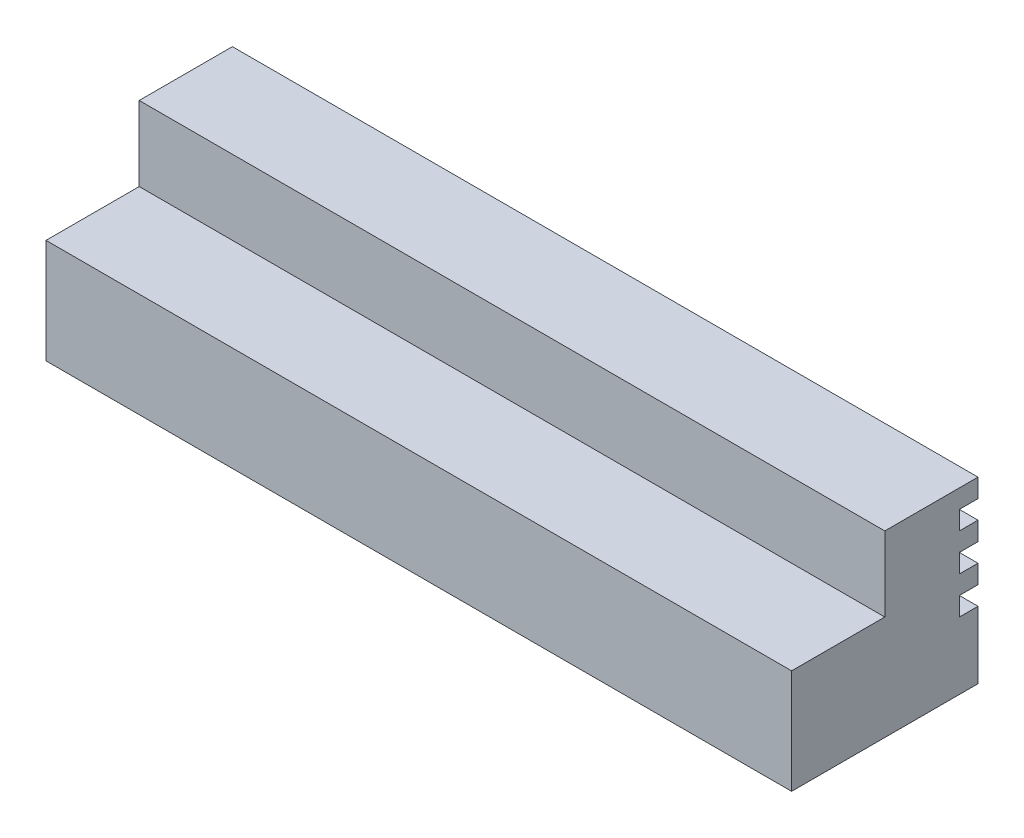
ISO-10303-21;
HEADER;
FILE_DESCRIPTION(('STEP AP214'),'2;1');
FILE_NAME('part.step','',(''),(''),'','','');
FILE_SCHEMA(('AUTOMOTIVE_DESIGN { 1 0 10303 214 1 1 1 1 }'));
ENDSEC;
DATA;
#1=APPLICATION_CONTEXT('core data for automotive mechanical design processes');
#2=APPLICATION_PROTOCOL_DEFINITION('international standard','automotive_design',2000,#1);
#3=PRODUCT_CONTEXT('',#1,'mechanical');
#4=PRODUCT('Part','Part','',(#3));
#5=PRODUCT_RELATED_PRODUCT_CATEGORY('part','',(#4));
#6=PRODUCT_DEFINITION_FORMATION('','',#4);
#7=PRODUCT_DEFINITION_CONTEXT('part definition',#1,'design');
#8=PRODUCT_DEFINITION('design','',#6,#7);
#9=PRODUCT_DEFINITION_SHAPE('','',#8);
#10=(LENGTH_UNIT() NAMED_UNIT(*) SI_UNIT(.MILLI.,.METRE.));
#11=(NAMED_UNIT(*) PLANE_ANGLE_UNIT() SI_UNIT($,.RADIAN.));
#12=(NAMED_UNIT(*) SI_UNIT($,.STERADIAN.) SOLID_ANGLE_UNIT());
#13=UNCERTAINTY_MEASURE_WITH_UNIT(LENGTH_MEASURE(1.E-05),#10,'distance_accuracy_value','');
#14=(GEOMETRIC_REPRESENTATION_CONTEXT(3) GLOBAL_UNCERTAINTY_ASSIGNED_CONTEXT((#13)) GLOBAL_UNIT_ASSIGNED_CONTEXT((#10,
#11,#12)) REPRESENTATION_CONTEXT('',''));
#15=CARTESIAN_POINT('',(0.,0.,0.));
#16=DIRECTION('',(0.,0.,1.));
#17=DIRECTION('',(1.,0.,0.));
#18=AXIS2_PLACEMENT_3D('',#15,#16,#17);
#19=CARTESIAN_POINT('',(0.,48.,-50.));
#20=DIRECTION('',(0.,0.,1.));
#21=DIRECTION('',(1.,0.,0.));
#22=AXIS2_PLACEMENT_3D('',#19,#20,#21);
#23=PLANE('',#22);
#24=DIRECTION('',(0.,-1.,0.));
#25=VECTOR('',#24,1.);
#26=CARTESIAN_POINT('',(0.,48.,-50.));
#27=LINE('',#26,#25);
#28=CARTESIAN_POINT('',(0.,18.,-50.));
#29=VERTEX_POINT('',#28);
#30=CARTESIAN_POINT('',(0.,0.,-50.));
#31=VERTEX_POINT('',#30);
#32=EDGE_CURVE('E183',#29,#31,#27,.T.);
#33=ORIENTED_EDGE('',*,*,#32,.F.);
#34=DIRECTION('',(1.,0.,0.));
#35=VECTOR('',#34,1.);
#36=CARTESIAN_POINT('',(0.,18.,-50.));
#37=LINE('',#36,#35);
#38=CARTESIAN_POINT('',(200.,18.,-50.));
#39=VERTEX_POINT('',#38);
#40=EDGE_CURVE('E288',#29,#39,#37,.T.);
#41=ORIENTED_EDGE('',*,*,#40,.T.);
#42=DIRECTION('',(0.,-1.,0.));
#43=VECTOR('',#42,1.);
#44=CARTESIAN_POINT('',(200.,48.,-50.));
#45=LINE('',#44,#43);
#46=CARTESIAN_POINT('',(200.,0.,-50.));
#47=VERTEX_POINT('',#46);
#48=EDGE_CURVE('E191',#39,#47,#45,.T.);
#49=ORIENTED_EDGE('',*,*,#48,.T.);
#50=DIRECTION('',(-1.,0.,0.));
#51=VECTOR('',#50,1.);
#52=CARTESIAN_POINT('',(0.,0.,-50.));
#53=LINE('',#52,#51);
#54=EDGE_CURVE('E192',#47,#31,#53,.T.);
#55=ORIENTED_EDGE('',*,*,#54,.T.);
#56=EDGE_LOOP('',(#33,#41,#49,#55));
#57=FACE_BOUND('',#56,.T.);
#58=ADVANCED_FACE('F34',(#57),#23,.F.);
#59=CARTESIAN_POINT('',(200.,28.,-50.));
#60=VERTEX_POINT('',#59);
#61=CARTESIAN_POINT('',(200.,23.,-50.));
#62=VERTEX_POINT('',#61);
#63=EDGE_CURVE('E175',#60,#62,#45,.T.);
#64=ORIENTED_EDGE('',*,*,#63,.T.);
#65=DIRECTION('',(1.,0.,0.));
#66=VECTOR('',#65,1.);
#67=CARTESIAN_POINT('',(0.,23.,-50.));
#68=LINE('',#67,#66);
#69=CARTESIAN_POINT('',(0.,23.,-50.));
#70=VERTEX_POINT('',#69);
#71=EDGE_CURVE('E49',#70,#62,#68,.T.);
#72=ORIENTED_EDGE('',*,*,#71,.F.);
#73=CARTESIAN_POINT('',(0.,28.,-50.));
#74=VERTEX_POINT('',#73);
#75=EDGE_CURVE('E173',#74,#70,#27,.T.);
#76=ORIENTED_EDGE('',*,*,#75,.F.);
#77=DIRECTION('',(1.,0.,0.));
#78=VECTOR('',#77,1.);
#79=CARTESIAN_POINT('',(0.,28.,-50.));
#80=LINE('',#79,#78);
#81=EDGE_CURVE('E266',#74,#60,#80,.T.);
#82=ORIENTED_EDGE('',*,*,#81,.T.);
#83=EDGE_LOOP('',(#64,#72,#76,#82));
#84=FACE_BOUND('',#83,.T.);
#85=ADVANCED_FACE('F171',(#84),#23,.F.);
#86=CARTESIAN_POINT('',(200.,38.,-50.));
#87=VERTEX_POINT('',#86);
#88=CARTESIAN_POINT('',(200.,33.,-50.));
#89=VERTEX_POINT('',#88);
#90=EDGE_CURVE('E196',#87,#89,#45,.T.);
#91=ORIENTED_EDGE('',*,*,#90,.T.);
#92=DIRECTION('',(1.,0.,0.));
#93=VECTOR('',#92,1.);
#94=CARTESIAN_POINT('',(0.,33.,-50.));
#95=LINE('',#94,#93);
#96=CARTESIAN_POINT('',(0.,33.,-50.));
#97=VERTEX_POINT('',#96);
#98=EDGE_CURVE('E57',#97,#89,#95,.T.);
#99=ORIENTED_EDGE('',*,*,#98,.F.);
#100=CARTESIAN_POINT('',(0.,38.,-50.));
#101=VERTEX_POINT('',#100);
#102=EDGE_CURVE('E182',#101,#97,#27,.T.);
#103=ORIENTED_EDGE('',*,*,#102,.F.);
#104=DIRECTION('',(1.,0.,0.));
#105=VECTOR('',#104,1.);
#106=CARTESIAN_POINT('',(0.,38.,-50.));
#107=LINE('',#106,#105);
#108=EDGE_CURVE('E243',#101,#87,#107,.T.);
#109=ORIENTED_EDGE('',*,*,#108,.T.);
#110=EDGE_LOOP('',(#91,#99,#103,#109));
#111=FACE_BOUND('',#110,.T.);
#112=ADVANCED_FACE('F319',(#111),#23,.F.);
#113=CARTESIAN_POINT('',(0.,48.,0.));
#114=DIRECTION('',(1.,0.,0.));
#115=DIRECTION('',(0.,0.,-1.));
#116=AXIS2_PLACEMENT_3D('',#113,#114,#115);
#117=PLANE('',#116);
#118=DIRECTION('',(0.,-1.,0.));
#119=VECTOR('',#118,1.);
#120=CARTESIAN_POINT('',(0.,23.,-45.));
#121=LINE('',#120,#119);
#122=CARTESIAN_POINT('',(0.,23.,-45.));
#123=VERTEX_POINT('',#122);
#124=CARTESIAN_POINT('',(0.,18.,-45.));
#125=VERTEX_POINT('',#124);
#126=EDGE_CURVE('E165',#123,#125,#121,.T.);
#127=ORIENTED_EDGE('',*,*,#126,.T.);
#128=DIRECTION('',(0.,0.,-1.));
#129=VECTOR('',#128,1.);
#130=CARTESIAN_POINT('',(0.,18.,-50.));
#131=LINE('',#130,#129);
#132=EDGE_CURVE('E176',#125,#29,#131,.T.);
#133=ORIENTED_EDGE('',*,*,#132,.T.);
#134=ORIENTED_EDGE('',*,*,#32,.T.);
#135=DIRECTION('',(0.,0.,1.));
#136=VECTOR('',#135,1.);
#137=CARTESIAN_POINT('',(0.,0.,0.));
#138=LINE('',#137,#136);
#139=CARTESIAN_POINT('',(0.,0.,0.));
#140=VERTEX_POINT('',#139);
#141=EDGE_CURVE('E219',#31,#140,#138,.T.);
#142=ORIENTED_EDGE('',*,*,#141,.T.);
#143=DIRECTION('',(0.,-1.,0.));
#144=VECTOR('',#143,1.);
#145=CARTESIAN_POINT('',(0.,48.,0.));
#146=LINE('',#145,#144);
#147=CARTESIAN_POINT('',(0.,28.,0.));
#148=VERTEX_POINT('',#147);
#149=EDGE_CURVE('E11',#148,#140,#146,.T.);
#150=ORIENTED_EDGE('',*,*,#149,.F.);
#151=DIRECTION('',(0.,0.,-1.));
#152=VECTOR('',#151,1.);
#153=CARTESIAN_POINT('',(0.,28.,0.));
#154=LINE('',#153,#152);
#155=CARTESIAN_POINT('',(0.,28.,-25.));
#156=VERTEX_POINT('',#155);
#157=EDGE_CURVE('E241',#148,#156,#154,.T.);
#158=ORIENTED_EDGE('',*,*,#157,.T.);
#159=DIRECTION('',(0.,1.,0.));
#160=VECTOR('',#159,1.);
#161=CARTESIAN_POINT('',(0.,48.,-25.));
#162=LINE('',#161,#160);
#163=CARTESIAN_POINT('',(0.,48.,-25.));
#164=VERTEX_POINT('',#163);
#165=EDGE_CURVE('E235',#156,#164,#162,.T.);
#166=ORIENTED_EDGE('',*,*,#165,.T.);
#167=DIRECTION('',(0.,0.,1.));
#168=VECTOR('',#167,1.);
#169=CARTESIAN_POINT('',(0.,48.,0.));
#170=LINE('',#169,#168);
#171=CARTESIAN_POINT('',(0.,48.,-50.));
#172=VERTEX_POINT('',#171);
#173=EDGE_CURVE('E223',#172,#164,#170,.T.);
#174=ORIENTED_EDGE('',*,*,#173,.F.);
#175=CARTESIAN_POINT('',(0.,43.,-50.));
#176=VERTEX_POINT('',#175);
#177=EDGE_CURVE('E186',#172,#176,#27,.T.);
#178=ORIENTED_EDGE('',*,*,#177,.T.);
#179=DIRECTION('',(0.,0.,1.));
#180=VECTOR('',#179,1.);
#181=CARTESIAN_POINT('',(0.,43.,-50.));
#182=LINE('',#181,#180);
#183=CARTESIAN_POINT('',(0.,43.,-45.));
#184=VERTEX_POINT('',#183);
#185=EDGE_CURVE('E259',#176,#184,#182,.T.);
#186=ORIENTED_EDGE('',*,*,#185,.T.);
#187=DIRECTION('',(0.,-1.,0.));
#188=VECTOR('',#187,1.);
#189=CARTESIAN_POINT('',(0.,43.,-45.));
#190=LINE('',#189,#188);
#191=CARTESIAN_POINT('',(0.,38.,-45.));
#192=VERTEX_POINT('',#191);
#193=EDGE_CURVE('E269',#184,#192,#190,.T.);
#194=ORIENTED_EDGE('',*,*,#193,.T.);
#195=DIRECTION('',(0.,0.,-1.));
#196=VECTOR('',#195,1.);
#197=CARTESIAN_POINT('',(0.,38.,-50.));
#198=LINE('',#197,#196);
#199=EDGE_CURVE('E251',#192,#101,#198,.T.);
#200=ORIENTED_EDGE('',*,*,#199,.T.);
#201=ORIENTED_EDGE('',*,*,#102,.T.);
#202=DIRECTION('',(0.,0.,1.));
#203=VECTOR('',#202,1.);
#204=CARTESIAN_POINT('',(0.,33.,-50.));
#205=LINE('',#204,#203);
#206=CARTESIAN_POINT('',(0.,33.,-45.));
#207=VERTEX_POINT('',#206);
#208=EDGE_CURVE('E282',#97,#207,#205,.T.);
#209=ORIENTED_EDGE('',*,*,#208,.T.);
#210=DIRECTION('',(0.,-1.,0.));
#211=VECTOR('',#210,1.);
#212=CARTESIAN_POINT('',(0.,33.,-45.));
#213=LINE('',#212,#211);
#214=CARTESIAN_POINT('',(0.,28.,-45.));
#215=VERTEX_POINT('',#214);
#216=EDGE_CURVE('E290',#207,#215,#213,.T.);
#217=ORIENTED_EDGE('',*,*,#216,.T.);
#218=DIRECTION('',(0.,0.,-1.));
#219=VECTOR('',#218,1.);
#220=CARTESIAN_POINT('',(0.,28.,-50.));
#221=LINE('',#220,#219);
#222=EDGE_CURVE('E181',#215,#74,#221,.T.);
#223=ORIENTED_EDGE('',*,*,#222,.T.);
#224=ORIENTED_EDGE('',*,*,#75,.T.);
#225=DIRECTION('',(0.,0.,1.));
#226=VECTOR('',#225,1.);
#227=CARTESIAN_POINT('',(0.,23.,-50.));
#228=LINE('',#227,#226);
#229=EDGE_CURVE('E158',#70,#123,#228,.T.);
#230=ORIENTED_EDGE('',*,*,#229,.T.);
#231=EDGE_LOOP('',(#127,#133,#134,#142,#150,#158,#166,#174,#178,#186,#194,#200,#201,#209,#217,
#223,#224,#230));
#232=FACE_BOUND('',#231,.T.);
#233=ADVANCED_FACE('F36',(#232),#117,.F.);
#234=CARTESIAN_POINT('',(0.,48.,0.));
#235=DIRECTION('',(0.,0.,-1.));
#236=DIRECTION('',(-1.,0.,0.));
#237=AXIS2_PLACEMENT_3D('',#234,#235,#236);
#238=PLANE('',#237);
#239=DIRECTION('',(0.,-1.,0.));
#240=VECTOR('',#239,1.);
#241=CARTESIAN_POINT('',(200.,48.,0.));
#242=LINE('',#241,#240);
#243=CARTESIAN_POINT('',(200.,28.,0.));
#244=VERTEX_POINT('',#243);
#245=CARTESIAN_POINT('',(200.,0.,0.));
#246=VERTEX_POINT('',#245);
#247=EDGE_CURVE('E42',#244,#246,#242,.T.);
#248=ORIENTED_EDGE('',*,*,#247,.F.);
#249=DIRECTION('',(1.,0.,0.));
#250=VECTOR('',#249,1.);
#251=CARTESIAN_POINT('',(0.,28.,0.));
#252=LINE('',#251,#250);
#253=EDGE_CURVE('E232',#148,#244,#252,.T.);
#254=ORIENTED_EDGE('',*,*,#253,.F.);
#255=ORIENTED_EDGE('',*,*,#149,.T.);
#256=DIRECTION('',(1.,0.,0.));
#257=VECTOR('',#256,1.);
#258=CARTESIAN_POINT('',(0.,0.,0.));
#259=LINE('',#258,#257);
#260=EDGE_CURVE('E213',#140,#246,#259,.T.);
#261=ORIENTED_EDGE('',*,*,#260,.T.);
#262=EDGE_LOOP('',(#248,#254,#255,#261));
#263=FACE_BOUND('',#262,.T.);
#264=ADVANCED_FACE('F214',(#263),#238,.F.);
#265=CARTESIAN_POINT('',(200.,48.,0.));
#266=DIRECTION('',(-1.,0.,0.));
#267=DIRECTION('',(0.,0.,1.));
#268=AXIS2_PLACEMENT_3D('',#265,#266,#267);
#269=PLANE('',#268);
#270=ORIENTED_EDGE('',*,*,#48,.F.);
#271=DIRECTION('',(0.,0.,-1.));
#272=VECTOR('',#271,1.);
#273=CARTESIAN_POINT('',(200.,18.,-50.));
#274=LINE('',#273,#272);
#275=CARTESIAN_POINT('',(200.,18.,-45.));
#276=VERTEX_POINT('',#275);
#277=EDGE_CURVE('E166',#276,#39,#274,.T.);
#278=ORIENTED_EDGE('',*,*,#277,.F.);
#279=DIRECTION('',(0.,-1.,0.));
#280=VECTOR('',#279,1.);
#281=CARTESIAN_POINT('',(200.,23.,-45.));
#282=LINE('',#281,#280);
#283=CARTESIAN_POINT('',(200.,23.,-45.));
#284=VERTEX_POINT('',#283);
#285=EDGE_CURVE('E300',#284,#276,#282,.T.);
#286=ORIENTED_EDGE('',*,*,#285,.F.);
#287=DIRECTION('',(0.,0.,1.));
#288=VECTOR('',#287,1.);
#289=CARTESIAN_POINT('',(200.,23.,-50.));
#290=LINE('',#289,#288);
#291=EDGE_CURVE('E303',#62,#284,#290,.T.);
#292=ORIENTED_EDGE('',*,*,#291,.F.);
#293=ORIENTED_EDGE('',*,*,#63,.F.);
#294=DIRECTION('',(0.,0.,-1.));
#295=VECTOR('',#294,1.);
#296=CARTESIAN_POINT('',(200.,28.,-50.));
#297=LINE('',#296,#295);
#298=CARTESIAN_POINT('',(200.,28.,-45.));
#299=VERTEX_POINT('',#298);
#300=EDGE_CURVE('E280',#299,#60,#297,.T.);
#301=ORIENTED_EDGE('',*,*,#300,.F.);
#302=DIRECTION('',(0.,-1.,0.));
#303=VECTOR('',#302,1.);
#304=CARTESIAN_POINT('',(200.,33.,-45.));
#305=LINE('',#304,#303);
#306=CARTESIAN_POINT('',(200.,33.,-45.));
#307=VERTEX_POINT('',#306);
#308=EDGE_CURVE('E283',#307,#299,#305,.T.);
#309=ORIENTED_EDGE('',*,*,#308,.F.);
#310=DIRECTION('',(0.,0.,1.));
#311=VECTOR('',#310,1.);
#312=CARTESIAN_POINT('',(200.,33.,-50.));
#313=LINE('',#312,#311);
#314=EDGE_CURVE('E286',#89,#307,#313,.T.);
#315=ORIENTED_EDGE('',*,*,#314,.F.);
#316=ORIENTED_EDGE('',*,*,#90,.F.);
#317=DIRECTION('',(0.,0.,-1.));
#318=VECTOR('',#317,1.);
#319=CARTESIAN_POINT('',(200.,38.,-50.));
#320=LINE('',#319,#318);
#321=CARTESIAN_POINT('',(200.,38.,-45.));
#322=VERTEX_POINT('',#321);
#323=EDGE_CURVE('E257',#322,#87,#320,.T.);
#324=ORIENTED_EDGE('',*,*,#323,.F.);
#325=DIRECTION('',(0.,-1.,0.));
#326=VECTOR('',#325,1.);
#327=CARTESIAN_POINT('',(200.,43.,-45.));
#328=LINE('',#327,#326);
#329=CARTESIAN_POINT('',(200.,43.,-45.));
#330=VERTEX_POINT('',#329);
#331=EDGE_CURVE('E260',#330,#322,#328,.T.);
#332=ORIENTED_EDGE('',*,*,#331,.F.);
#333=DIRECTION('',(0.,0.,1.));
#334=VECTOR('',#333,1.);
#335=CARTESIAN_POINT('',(200.,43.,-50.));
#336=LINE('',#335,#334);
#337=CARTESIAN_POINT('',(200.,43.,-50.));
#338=VERTEX_POINT('',#337);
#339=EDGE_CURVE('E263',#338,#330,#336,.T.);
#340=ORIENTED_EDGE('',*,*,#339,.F.);
#341=CARTESIAN_POINT('',(200.,48.,-50.));
#342=VERTEX_POINT('',#341);
#343=EDGE_CURVE('E194',#342,#338,#45,.T.);
#344=ORIENTED_EDGE('',*,*,#343,.F.);
#345=DIRECTION('',(0.,0.,-1.));
#346=VECTOR('',#345,1.);
#347=CARTESIAN_POINT('',(200.,48.,0.));
#348=LINE('',#347,#346);
#349=CARTESIAN_POINT('',(200.,48.,-25.));
#350=VERTEX_POINT('',#349);
#351=EDGE_CURVE('E228',#350,#342,#348,.T.);
#352=ORIENTED_EDGE('',*,*,#351,.F.);
#353=DIRECTION('',(0.,1.,0.));
#354=VECTOR('',#353,1.);
#355=CARTESIAN_POINT('',(200.,48.,-25.));
#356=LINE('',#355,#354);
#357=CARTESIAN_POINT('',(200.,28.,-25.));
#358=VERTEX_POINT('',#357);
#359=EDGE_CURVE('E239',#358,#350,#356,.T.);
#360=ORIENTED_EDGE('',*,*,#359,.F.);
#361=DIRECTION('',(0.,0.,-1.));
#362=VECTOR('',#361,1.);
#363=CARTESIAN_POINT('',(200.,28.,0.));
#364=LINE('',#363,#362);
#365=EDGE_CURVE('E209',#244,#358,#364,.T.);
#366=ORIENTED_EDGE('',*,*,#365,.F.);
#367=ORIENTED_EDGE('',*,*,#247,.T.);
#368=DIRECTION('',(0.,0.,-1.));
#369=VECTOR('',#368,1.);
#370=CARTESIAN_POINT('',(200.,0.,0.));
#371=LINE('',#370,#369);
#372=EDGE_CURVE('E205',#246,#47,#371,.T.);
#373=ORIENTED_EDGE('',*,*,#372,.T.);
#374=EDGE_LOOP('',(#270,#278,#286,#292,#293,#301,#309,#315,#316,#324,#332,#340,#344,#352,#360,
#366,#367,#373));
#375=FACE_BOUND('',#374,.T.);
#376=ADVANCED_FACE('F203',(#375),#269,.F.);
#377=ORIENTED_EDGE('',*,*,#343,.T.);
#378=DIRECTION('',(1.,0.,0.));
#379=VECTOR('',#378,1.);
#380=CARTESIAN_POINT('',(0.,43.,-50.));
#381=LINE('',#380,#379);
#382=EDGE_CURVE('E248',#176,#338,#381,.T.);
#383=ORIENTED_EDGE('',*,*,#382,.F.);
#384=ORIENTED_EDGE('',*,*,#177,.F.);
#385=DIRECTION('',(-1.,0.,0.));
#386=VECTOR('',#385,1.);
#387=CARTESIAN_POINT('',(0.,48.,-50.));
#388=LINE('',#387,#386);
#389=EDGE_CURVE('E187',#342,#172,#388,.T.);
#390=ORIENTED_EDGE('',*,*,#389,.F.);
#391=EDGE_LOOP('',(#377,#383,#384,#390));
#392=FACE_BOUND('',#391,.T.);
#393=ADVANCED_FACE('F342',(#392),#23,.F.);
#394=CARTESIAN_POINT('',(0.,48.,-50.));
#395=DIRECTION('',(0.,-1.,0.));
#396=DIRECTION('',(0.,0.,-1.));
#397=AXIS2_PLACEMENT_3D('',#394,#395,#396);
#398=PLANE('',#397);
#399=ORIENTED_EDGE('',*,*,#173,.T.);
#400=DIRECTION('',(1.,0.,0.));
#401=VECTOR('',#400,1.);
#402=CARTESIAN_POINT('',(0.,48.,-25.));
#403=LINE('',#402,#401);
#404=EDGE_CURVE('E226',#164,#350,#403,.T.);
#405=ORIENTED_EDGE('',*,*,#404,.T.);
#406=ORIENTED_EDGE('',*,*,#351,.T.);
#407=ORIENTED_EDGE('',*,*,#389,.T.);
#408=EDGE_LOOP('',(#399,#405,#406,#407));
#409=FACE_BOUND('',#408,.T.);
#410=ADVANCED_FACE('F346',(#409),#398,.F.);
#411=CARTESIAN_POINT('',(0.,0.,-50.));
#412=DIRECTION('',(0.,-1.,0.));
#413=DIRECTION('',(0.,0.,-1.));
#414=AXIS2_PLACEMENT_3D('',#411,#412,#413);
#415=PLANE('',#414);
#416=ORIENTED_EDGE('',*,*,#141,.F.);
#417=ORIENTED_EDGE('',*,*,#54,.F.);
#418=ORIENTED_EDGE('',*,*,#372,.F.);
#419=ORIENTED_EDGE('',*,*,#260,.F.);
#420=EDGE_LOOP('',(#416,#417,#418,#419));
#421=FACE_BOUND('',#420,.T.);
#422=ADVANCED_FACE('F221',(#421),#415,.T.);
#423=CARTESIAN_POINT('',(0.,48.,-25.));
#424=DIRECTION('',(0.,0.,-1.));
#425=DIRECTION('',(0.,1.,0.));
#426=AXIS2_PLACEMENT_3D('',#423,#424,#425);
#427=PLANE('',#426);
#428=ORIENTED_EDGE('',*,*,#359,.T.);
#429=ORIENTED_EDGE('',*,*,#404,.F.);
#430=ORIENTED_EDGE('',*,*,#165,.F.);
#431=DIRECTION('',(1.,0.,0.));
#432=VECTOR('',#431,1.);
#433=CARTESIAN_POINT('',(0.,28.,-25.));
#434=LINE('',#433,#432);
#435=EDGE_CURVE('E234',#156,#358,#434,.T.);
#436=ORIENTED_EDGE('',*,*,#435,.T.);
#437=EDGE_LOOP('',(#428,#429,#430,#436));
#438=FACE_BOUND('',#437,.T.);
#439=ADVANCED_FACE('F348',(#438),#427,.F.);
#440=CARTESIAN_POINT('',(0.,28.,0.));
#441=DIRECTION('',(0.,-1.,0.));
#442=DIRECTION('',(0.,0.,-1.));
#443=AXIS2_PLACEMENT_3D('',#440,#441,#442);
#444=PLANE('',#443);
#445=ORIENTED_EDGE('',*,*,#365,.T.);
#446=ORIENTED_EDGE('',*,*,#435,.F.);
#447=ORIENTED_EDGE('',*,*,#157,.F.);
#448=ORIENTED_EDGE('',*,*,#253,.T.);
#449=EDGE_LOOP('',(#445,#446,#447,#448));
#450=FACE_BOUND('',#449,.T.);
#451=ADVANCED_FACE('F351',(#450),#444,.F.);
#452=CARTESIAN_POINT('',(0.,38.,-50.));
#453=DIRECTION('',(0.,-1.,0.));
#454=DIRECTION('',(0.,0.,-1.));
#455=AXIS2_PLACEMENT_3D('',#452,#453,#454);
#456=PLANE('',#455);
#457=ORIENTED_EDGE('',*,*,#323,.T.);
#458=ORIENTED_EDGE('',*,*,#108,.F.);
#459=ORIENTED_EDGE('',*,*,#199,.F.);
#460=DIRECTION('',(1.,0.,0.));
#461=VECTOR('',#460,1.);
#462=CARTESIAN_POINT('',(0.,38.,-45.));
#463=LINE('',#462,#461);
#464=EDGE_CURVE('E253',#192,#322,#463,.T.);
#465=ORIENTED_EDGE('',*,*,#464,.T.);
#466=EDGE_LOOP('',(#457,#458,#459,#465));
#467=FACE_BOUND('',#466,.T.);
#468=ADVANCED_FACE('F332',(#467),#456,.F.);
#469=CARTESIAN_POINT('',(0.,43.,-45.));
#470=DIRECTION('',(0.,0.,1.));
#471=DIRECTION('',(1.,0.,0.));
#472=AXIS2_PLACEMENT_3D('',#469,#470,#471);
#473=PLANE('',#472);
#474=ORIENTED_EDGE('',*,*,#331,.T.);
#475=ORIENTED_EDGE('',*,*,#464,.F.);
#476=ORIENTED_EDGE('',*,*,#193,.F.);
#477=DIRECTION('',(1.,0.,0.));
#478=VECTOR('',#477,1.);
#479=CARTESIAN_POINT('',(0.,43.,-45.));
#480=LINE('',#479,#478);
#481=EDGE_CURVE('E250',#184,#330,#480,.T.);
#482=ORIENTED_EDGE('',*,*,#481,.T.);
#483=EDGE_LOOP('',(#474,#475,#476,#482));
#484=FACE_BOUND('',#483,.T.);
#485=ADVANCED_FACE('F334',(#484),#473,.F.);
#486=CARTESIAN_POINT('',(0.,43.,-50.));
#487=DIRECTION('',(0.,1.,0.));
#488=DIRECTION('',(0.,0.,1.));
#489=AXIS2_PLACEMENT_3D('',#486,#487,#488);
#490=PLANE('',#489);
#491=ORIENTED_EDGE('',*,*,#339,.T.);
#492=ORIENTED_EDGE('',*,*,#481,.F.);
#493=ORIENTED_EDGE('',*,*,#185,.F.);
#494=ORIENTED_EDGE('',*,*,#382,.T.);
#495=EDGE_LOOP('',(#491,#492,#493,#494));
#496=FACE_BOUND('',#495,.T.);
#497=ADVANCED_FACE('F352',(#496),#490,.F.);
#498=CARTESIAN_POINT('',(0.,28.,-50.));
#499=DIRECTION('',(0.,-1.,0.));
#500=DIRECTION('',(0.,0.,-1.));
#501=AXIS2_PLACEMENT_3D('',#498,#499,#500);
#502=PLANE('',#501);
#503=ORIENTED_EDGE('',*,*,#300,.T.);
#504=ORIENTED_EDGE('',*,*,#81,.F.);
#505=ORIENTED_EDGE('',*,*,#222,.F.);
#506=DIRECTION('',(1.,0.,0.));
#507=VECTOR('',#506,1.);
#508=CARTESIAN_POINT('',(0.,28.,-45.));
#509=LINE('',#508,#507);
#510=EDGE_CURVE('E277',#215,#299,#509,.T.);
#511=ORIENTED_EDGE('',*,*,#510,.T.);
#512=EDGE_LOOP('',(#503,#504,#505,#511));
#513=FACE_BOUND('',#512,.T.);
#514=ADVANCED_FACE('F354',(#513),#502,.F.);
#515=CARTESIAN_POINT('',(0.,33.,-45.));
#516=DIRECTION('',(0.,0.,1.));
#517=DIRECTION('',(1.,0.,0.));
#518=AXIS2_PLACEMENT_3D('',#515,#516,#517);
#519=PLANE('',#518);
#520=ORIENTED_EDGE('',*,*,#308,.T.);
#521=ORIENTED_EDGE('',*,*,#510,.F.);
#522=ORIENTED_EDGE('',*,*,#216,.F.);
#523=DIRECTION('',(1.,0.,0.));
#524=VECTOR('',#523,1.);
#525=CARTESIAN_POINT('',(0.,33.,-45.));
#526=LINE('',#525,#524);
#527=EDGE_CURVE('E275',#207,#307,#526,.T.);
#528=ORIENTED_EDGE('',*,*,#527,.T.);
#529=EDGE_LOOP('',(#520,#521,#522,#528));
#530=FACE_BOUND('',#529,.T.);
#531=ADVANCED_FACE('F328',(#530),#519,.F.);
#532=CARTESIAN_POINT('',(0.,33.,-50.));
#533=DIRECTION('',(0.,1.,0.));
#534=DIRECTION('',(0.,0.,1.));
#535=AXIS2_PLACEMENT_3D('',#532,#533,#534);
#536=PLANE('',#535);
#537=ORIENTED_EDGE('',*,*,#314,.T.);
#538=ORIENTED_EDGE('',*,*,#527,.F.);
#539=ORIENTED_EDGE('',*,*,#208,.F.);
#540=ORIENTED_EDGE('',*,*,#98,.T.);
#541=EDGE_LOOP('',(#537,#538,#539,#540));
#542=FACE_BOUND('',#541,.T.);
#543=ADVANCED_FACE('F325',(#542),#536,.F.);
#544=CARTESIAN_POINT('',(0.,18.,-50.));
#545=DIRECTION('',(0.,-1.,0.));
#546=DIRECTION('',(0.,0.,-1.));
#547=AXIS2_PLACEMENT_3D('',#544,#545,#546);
#548=PLANE('',#547);
#549=ORIENTED_EDGE('',*,*,#277,.T.);
#550=ORIENTED_EDGE('',*,*,#40,.F.);
#551=ORIENTED_EDGE('',*,*,#132,.F.);
#552=DIRECTION('',(1.,0.,0.));
#553=VECTOR('',#552,1.);
#554=CARTESIAN_POINT('',(0.,18.,-45.));
#555=LINE('',#554,#553);
#556=EDGE_CURVE('E295',#125,#276,#555,.T.);
#557=ORIENTED_EDGE('',*,*,#556,.T.);
#558=EDGE_LOOP('',(#549,#550,#551,#557));
#559=FACE_BOUND('',#558,.T.);
#560=ADVANCED_FACE('F314',(#559),#548,.F.);
#561=CARTESIAN_POINT('',(0.,23.,-45.));
#562=DIRECTION('',(0.,0.,1.));
#563=DIRECTION('',(1.,0.,0.));
#564=AXIS2_PLACEMENT_3D('',#561,#562,#563);
#565=PLANE('',#564);
#566=ORIENTED_EDGE('',*,*,#285,.T.);
#567=ORIENTED_EDGE('',*,*,#556,.F.);
#568=ORIENTED_EDGE('',*,*,#126,.F.);
#569=DIRECTION('',(1.,0.,0.));
#570=VECTOR('',#569,1.);
#571=CARTESIAN_POINT('',(0.,23.,-45.));
#572=LINE('',#571,#570);
#573=EDGE_CURVE('E160',#123,#284,#572,.T.);
#574=ORIENTED_EDGE('',*,*,#573,.T.);
#575=EDGE_LOOP('',(#566,#567,#568,#574));
#576=FACE_BOUND('',#575,.T.);
#577=ADVANCED_FACE('F310',(#576),#565,.F.);
#578=CARTESIAN_POINT('',(0.,23.,-50.));
#579=DIRECTION('',(0.,1.,0.));
#580=DIRECTION('',(0.,0.,1.));
#581=AXIS2_PLACEMENT_3D('',#578,#579,#580);
#582=PLANE('',#581);
#583=ORIENTED_EDGE('',*,*,#291,.T.);
#584=ORIENTED_EDGE('',*,*,#573,.F.);
#585=ORIENTED_EDGE('',*,*,#229,.F.);
#586=ORIENTED_EDGE('',*,*,#71,.T.);
#587=EDGE_LOOP('',(#583,#584,#585,#586));
#588=FACE_BOUND('',#587,.T.);
#589=ADVANCED_FACE('F159',(#588),#582,.F.);
#590=CLOSED_SHELL('',(#58,#85,#112,#233,#264,#376,#393,#410,#422,#439,#451,#468,#485,#497,#514,
#531,#543,#560,#577,#589));
#591=MANIFOLD_SOLID_BREP('B2',#590);
#592=ADVANCED_BREP_SHAPE_REPRESENTATION('',(#18,#591),#14);
#593=SHAPE_DEFINITION_REPRESENTATION(#9,#592);
ENDSEC;
END-ISO-10303-21;
